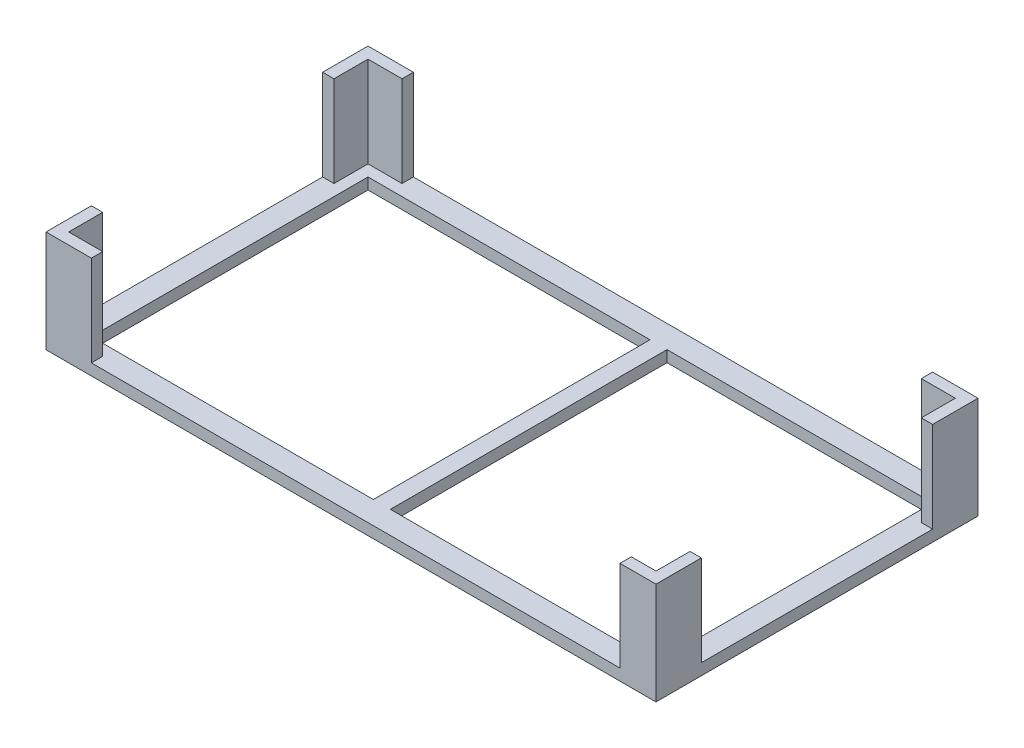
ISO-10303-21;
HEADER;
FILE_DESCRIPTION(('STEP AP214'),'2;1');
FILE_NAME('part.step','',(''),(''),'','','');
FILE_SCHEMA(('AUTOMOTIVE_DESIGN { 1 0 10303 214 1 1 1 1 }'));
ENDSEC;
DATA;
#1=APPLICATION_CONTEXT('core data for automotive mechanical design processes');
#2=APPLICATION_PROTOCOL_DEFINITION('international standard','automotive_design',2000,#1);
#3=PRODUCT_CONTEXT('',#1,'mechanical');
#4=PRODUCT('Part','Part','',(#3));
#5=PRODUCT_RELATED_PRODUCT_CATEGORY('part','',(#4));
#6=PRODUCT_DEFINITION_FORMATION('','',#4);
#7=PRODUCT_DEFINITION_CONTEXT('part definition',#1,'design');
#8=PRODUCT_DEFINITION('design','',#6,#7);
#9=PRODUCT_DEFINITION_SHAPE('','',#8);
#10=(LENGTH_UNIT() NAMED_UNIT(*) SI_UNIT(.MILLI.,.METRE.));
#11=(NAMED_UNIT(*) PLANE_ANGLE_UNIT() SI_UNIT($,.RADIAN.));
#12=(NAMED_UNIT(*) SI_UNIT($,.STERADIAN.) SOLID_ANGLE_UNIT());
#13=UNCERTAINTY_MEASURE_WITH_UNIT(LENGTH_MEASURE(1.E-05),#10,'distance_accuracy_value','');
#14=(GEOMETRIC_REPRESENTATION_CONTEXT(3) GLOBAL_UNCERTAINTY_ASSIGNED_CONTEXT((#13)) GLOBAL_UNIT_ASSIGNED_CONTEXT((#10,
#11,#12)) REPRESENTATION_CONTEXT('',''));
#15=CARTESIAN_POINT('',(0.,0.,0.));
#16=DIRECTION('',(0.,0.,1.));
#17=DIRECTION('',(1.,0.,0.));
#18=AXIS2_PLACEMENT_3D('',#15,#16,#17);
#19=CARTESIAN_POINT('',(0.,1.,0.));
#20=DIRECTION('',(0.,1.,0.));
#21=DIRECTION('',(0.,0.,1.));
#22=AXIS2_PLACEMENT_3D('',#19,#20,#21);
#23=PLANE('',#22);
#24=DIRECTION('',(0.,0.,-1.));
#25=VECTOR('',#24,1.);
#26=CARTESIAN_POINT('',(26.8729730527753,1.,0.));
#27=LINE('',#26,#25);
#28=CARTESIAN_POINT('',(26.8729730527753,1.,26.4));
#29=VERTEX_POINT('',#28);
#30=CARTESIAN_POINT('',(26.8729730527753,1.,2.));
#31=VERTEX_POINT('',#30);
#32=EDGE_CURVE('E275',#29,#31,#27,.T.);
#33=ORIENTED_EDGE('',*,*,#32,.F.);
#34=DIRECTION('',(1.,0.,0.));
#35=VECTOR('',#34,1.);
#36=CARTESIAN_POINT('',(0.,1.,26.4));
#37=LINE('',#36,#35);
#38=CARTESIAN_POINT('',(2.00000000000001,1.,26.4));
#39=VERTEX_POINT('',#38);
#40=EDGE_CURVE('E268',#39,#29,#37,.T.);
#41=ORIENTED_EDGE('',*,*,#40,.F.);
#42=DIRECTION('',(0.,0.,1.));
#43=VECTOR('',#42,1.);
#44=CARTESIAN_POINT('',(2.,1.,0.));
#45=LINE('',#44,#43);
#46=CARTESIAN_POINT('',(2.,1.,2.));
#47=VERTEX_POINT('',#46);
#48=EDGE_CURVE('E248',#47,#39,#45,.T.);
#49=ORIENTED_EDGE('',*,*,#48,.F.);
#50=DIRECTION('',(-1.,0.,0.));
#51=VECTOR('',#50,1.);
#52=CARTESIAN_POINT('',(0.,1.,2.));
#53=LINE('',#52,#51);
#54=EDGE_CURVE('E273',#31,#47,#53,.T.);
#55=ORIENTED_EDGE('',*,*,#54,.F.);
#56=EDGE_LOOP('',(#33,#41,#49,#55));
#57=FACE_BOUND('',#56,.T.);
#58=DIRECTION('',(0.,0.,1.));
#59=VECTOR('',#58,1.);
#60=CARTESIAN_POINT('',(28.3729730527753,1.,0.));
#61=LINE('',#60,#59);
#62=CARTESIAN_POINT('',(28.3729730527753,1.,2.));
#63=VERTEX_POINT('',#62);
#64=CARTESIAN_POINT('',(28.3729730527753,1.,26.4));
#65=VERTEX_POINT('',#64);
#66=EDGE_CURVE('E304',#63,#65,#61,.T.);
#67=ORIENTED_EDGE('',*,*,#66,.F.);
#68=DIRECTION('',(-1.,0.,0.));
#69=VECTOR('',#68,1.);
#70=CARTESIAN_POINT('',(0.,1.,2.));
#71=LINE('',#70,#69);
#72=CARTESIAN_POINT('',(51.8,1.,2.));
#73=VERTEX_POINT('',#72);
#74=EDGE_CURVE('E291',#73,#63,#71,.T.);
#75=ORIENTED_EDGE('',*,*,#74,.F.);
#76=DIRECTION('',(0.,0.,-1.));
#77=VECTOR('',#76,1.);
#78=CARTESIAN_POINT('',(51.8,1.,0.));
#79=LINE('',#78,#77);
#80=CARTESIAN_POINT('',(51.8,1.,26.4));
#81=VERTEX_POINT('',#80);
#82=EDGE_CURVE('E299',#81,#73,#79,.T.);
#83=ORIENTED_EDGE('',*,*,#82,.F.);
#84=DIRECTION('',(1.,0.,0.));
#85=VECTOR('',#84,1.);
#86=CARTESIAN_POINT('',(0.,1.,26.4));
#87=LINE('',#86,#85);
#88=EDGE_CURVE('E302',#65,#81,#87,.T.);
#89=ORIENTED_EDGE('',*,*,#88,.F.);
#90=EDGE_LOOP('',(#67,#75,#83,#89));
#91=FACE_BOUND('',#90,.T.);
#92=DIRECTION('',(0.,0.,-1.));
#93=VECTOR('',#92,1.);
#94=CARTESIAN_POINT('',(1.,1.,1.));
#95=LINE('',#94,#93);
#96=CARTESIAN_POINT('',(1.,1.,4.));
#97=VERTEX_POINT('',#96);
#98=CARTESIAN_POINT('',(1.,1.,1.));
#99=VERTEX_POINT('',#98);
#100=EDGE_CURVE('E324',#97,#99,#95,.T.);
#101=ORIENTED_EDGE('',*,*,#100,.F.);
#102=DIRECTION('',(1.,0.,0.));
#103=VECTOR('',#102,1.);
#104=CARTESIAN_POINT('',(0.,1.,4.));
#105=LINE('',#104,#103);
#106=CARTESIAN_POINT('',(0.,1.,4.));
#107=VERTEX_POINT('',#106);
#108=EDGE_CURVE('E306',#107,#97,#105,.T.);
#109=ORIENTED_EDGE('',*,*,#108,.F.);
#110=DIRECTION('',(0.,0.,1.));
#111=VECTOR('',#110,1.);
#112=CARTESIAN_POINT('',(0.,1.,0.));
#113=LINE('',#112,#111);
#114=CARTESIAN_POINT('',(0.,1.,24.4));
#115=VERTEX_POINT('',#114);
#116=EDGE_CURVE('E464',#107,#115,#113,.T.);
#117=ORIENTED_EDGE('',*,*,#116,.T.);
#118=DIRECTION('',(-1.,0.,0.));
#119=VECTOR('',#118,1.);
#120=CARTESIAN_POINT('',(0.,1.,24.4));
#121=LINE('',#120,#119);
#122=CARTESIAN_POINT('',(1.,1.,24.4));
#123=VERTEX_POINT('',#122);
#124=EDGE_CURVE('E365',#123,#115,#121,.T.);
#125=ORIENTED_EDGE('',*,*,#124,.F.);
#126=DIRECTION('',(0.,0.,-1.));
#127=VECTOR('',#126,1.);
#128=CARTESIAN_POINT('',(1.,1.,27.4));
#129=LINE('',#128,#127);
#130=CARTESIAN_POINT('',(1.,1.,27.4));
#131=VERTEX_POINT('',#130);
#132=EDGE_CURVE('E346',#131,#123,#129,.T.);
#133=ORIENTED_EDGE('',*,*,#132,.F.);
#134=DIRECTION('',(-1.,0.,0.));
#135=VECTOR('',#134,1.);
#136=CARTESIAN_POINT('',(1.,1.,27.4));
#137=LINE('',#136,#135);
#138=CARTESIAN_POINT('',(4.00000000000001,1.,27.4));
#139=VERTEX_POINT('',#138);
#140=EDGE_CURVE('E351',#139,#131,#137,.T.);
#141=ORIENTED_EDGE('',*,*,#140,.F.);
#142=DIRECTION('',(0.,0.,-1.));
#143=VECTOR('',#142,1.);
#144=CARTESIAN_POINT('',(4.00000000000001,1.,28.4));
#145=LINE('',#144,#143);
#146=CARTESIAN_POINT('',(4.00000000000001,1.,28.4));
#147=VERTEX_POINT('',#146);
#148=EDGE_CURVE('E368',#147,#139,#145,.T.);
#149=ORIENTED_EDGE('',*,*,#148,.F.);
#150=DIRECTION('',(1.,0.,0.));
#151=VECTOR('',#150,1.);
#152=CARTESIAN_POINT('',(0.,1.,28.4));
#153=LINE('',#152,#151);
#154=CARTESIAN_POINT('',(50.6219949365268,1.,28.4));
#155=VERTEX_POINT('',#154);
#156=EDGE_CURVE('E466',#147,#155,#153,.T.);
#157=ORIENTED_EDGE('',*,*,#156,.T.);
#158=DIRECTION('',(0.,0.,1.));
#159=VECTOR('',#158,1.);
#160=CARTESIAN_POINT('',(50.6219949365268,1.,28.4));
#161=LINE('',#160,#159);
#162=CARTESIAN_POINT('',(50.6219949365268,1.,27.4));
#163=VERTEX_POINT('',#162);
#164=EDGE_CURVE('E427',#163,#155,#161,.T.);
#165=ORIENTED_EDGE('',*,*,#164,.F.);
#166=DIRECTION('',(-1.,0.,0.));
#167=VECTOR('',#166,1.);
#168=CARTESIAN_POINT('',(52.8,1.,27.4));
#169=LINE('',#168,#167);
#170=CARTESIAN_POINT('',(52.8,1.,27.4));
#171=VERTEX_POINT('',#170);
#172=EDGE_CURVE('E444',#171,#163,#169,.T.);
#173=ORIENTED_EDGE('',*,*,#172,.F.);
#174=DIRECTION('',(0.,0.,1.));
#175=VECTOR('',#174,1.);
#176=CARTESIAN_POINT('',(52.8,1.,27.4));
#177=LINE('',#176,#175);
#178=CARTESIAN_POINT('',(52.8,1.,24.4));
#179=VERTEX_POINT('',#178);
#180=EDGE_CURVE('E441',#179,#171,#177,.T.);
#181=ORIENTED_EDGE('',*,*,#180,.F.);
#182=DIRECTION('',(-1.,0.,0.));
#183=VECTOR('',#182,1.);
#184=CARTESIAN_POINT('',(53.8,1.,24.4));
#185=LINE('',#184,#183);
#186=CARTESIAN_POINT('',(53.8,1.,24.4));
#187=VERTEX_POINT('',#186);
#188=EDGE_CURVE('E422',#187,#179,#185,.T.);
#189=ORIENTED_EDGE('',*,*,#188,.F.);
#190=DIRECTION('',(0.,0.,-1.));
#191=VECTOR('',#190,1.);
#192=CARTESIAN_POINT('',(53.8,1.,0.));
#193=LINE('',#192,#191);
#194=CARTESIAN_POINT('',(53.8,1.,4.));
#195=VERTEX_POINT('',#194);
#196=EDGE_CURVE('E469',#187,#195,#193,.T.);
#197=ORIENTED_EDGE('',*,*,#196,.T.);
#198=DIRECTION('',(1.,0.,0.));
#199=VECTOR('',#198,1.);
#200=CARTESIAN_POINT('',(53.8,1.,4.));
#201=LINE('',#200,#199);
#202=CARTESIAN_POINT('',(52.8,1.,4.));
#203=VERTEX_POINT('',#202);
#204=EDGE_CURVE('E392',#203,#195,#201,.T.);
#205=ORIENTED_EDGE('',*,*,#204,.F.);
#206=DIRECTION('',(0.,0.,1.));
#207=VECTOR('',#206,1.);
#208=CARTESIAN_POINT('',(52.8,1.,1.));
#209=LINE('',#208,#207);
#210=CARTESIAN_POINT('',(52.8,1.,1.));
#211=VERTEX_POINT('',#210);
#212=EDGE_CURVE('E406',#211,#203,#209,.T.);
#213=ORIENTED_EDGE('',*,*,#212,.F.);
#214=DIRECTION('',(1.,0.,0.));
#215=VECTOR('',#214,1.);
#216=CARTESIAN_POINT('',(52.8,1.,1.));
#217=LINE('',#216,#215);
#218=CARTESIAN_POINT('',(49.8,1.,1.));
#219=VERTEX_POINT('',#218);
#220=EDGE_CURVE('E404',#219,#211,#217,.T.);
#221=ORIENTED_EDGE('',*,*,#220,.F.);
#222=DIRECTION('',(0.,0.,1.));
#223=VECTOR('',#222,1.);
#224=CARTESIAN_POINT('',(49.8,1.,0.));
#225=LINE('',#224,#223);
#226=CARTESIAN_POINT('',(49.8,1.,0.));
#227=VERTEX_POINT('',#226);
#228=EDGE_CURVE('E387',#227,#219,#225,.T.);
#229=ORIENTED_EDGE('',*,*,#228,.F.);
#230=DIRECTION('',(-1.,0.,0.));
#231=VECTOR('',#230,1.);
#232=CARTESIAN_POINT('',(0.,1.,0.));
#233=LINE('',#232,#231);
#234=CARTESIAN_POINT('',(4.,1.,0.));
#235=VERTEX_POINT('',#234);
#236=EDGE_CURVE('E472',#227,#235,#233,.T.);
#237=ORIENTED_EDGE('',*,*,#236,.T.);
#238=DIRECTION('',(0.,0.,-1.));
#239=VECTOR('',#238,1.);
#240=CARTESIAN_POINT('',(4.,1.,0.));
#241=LINE('',#240,#239);
#242=CARTESIAN_POINT('',(4.,1.,1.));
#243=VERTEX_POINT('',#242);
#244=EDGE_CURVE('E310',#243,#235,#241,.T.);
#245=ORIENTED_EDGE('',*,*,#244,.F.);
#246=DIRECTION('',(1.,0.,0.));
#247=VECTOR('',#246,1.);
#248=CARTESIAN_POINT('',(1.,1.,1.));
#249=LINE('',#248,#247);
#250=EDGE_CURVE('E327',#99,#243,#249,.T.);
#251=ORIENTED_EDGE('',*,*,#250,.F.);
#252=EDGE_LOOP('',(#101,#109,#117,#125,#133,#141,#149,#157,#165,#173,#181,#189,#197,#205,#213,
#221,#229,#237,#245,#251));
#253=FACE_BOUND('',#252,.T.);
#254=ADVANCED_FACE('F33',(#57,#91,#253),#23,.T.);
#255=CARTESIAN_POINT('',(0.,1.,0.));
#256=DIRECTION('',(1.,0.,0.));
#257=DIRECTION('',(0.,0.,-1.));
#258=AXIS2_PLACEMENT_3D('',#255,#256,#257);
#259=PLANE('',#258);
#260=DIRECTION('',(0.,0.,1.));
#261=VECTOR('',#260,1.);
#262=CARTESIAN_POINT('',(0.,0.,0.));
#263=LINE('',#262,#261);
#264=CARTESIAN_POINT('',(0.,0.,0.));
#265=VERTEX_POINT('',#264);
#266=CARTESIAN_POINT('',(0.,0.,28.4));
#267=VERTEX_POINT('',#266);
#268=EDGE_CURVE('E463',#265,#267,#263,.T.);
#269=ORIENTED_EDGE('',*,*,#268,.T.);
#270=DIRECTION('',(0.,-1.,0.));
#271=VECTOR('',#270,1.);
#272=CARTESIAN_POINT('',(0.,1.,28.4));
#273=LINE('',#272,#271);
#274=CARTESIAN_POINT('',(0.,9.,28.4));
#275=VERTEX_POINT('',#274);
#276=EDGE_CURVE('E11',#275,#267,#273,.T.);
#277=ORIENTED_EDGE('',*,*,#276,.F.);
#278=DIRECTION('',(0.,0.,1.));
#279=VECTOR('',#278,1.);
#280=CARTESIAN_POINT('',(0.,9.,27.4));
#281=LINE('',#280,#279);
#282=CARTESIAN_POINT('',(0.,9.,24.4));
#283=VERTEX_POINT('',#282);
#284=EDGE_CURVE('E353',#283,#275,#281,.T.);
#285=ORIENTED_EDGE('',*,*,#284,.F.);
#286=DIRECTION('',(0.,-1.,0.));
#287=VECTOR('',#286,1.);
#288=CARTESIAN_POINT('',(0.,9.,24.4));
#289=LINE('',#288,#287);
#290=EDGE_CURVE('E381',#283,#115,#289,.T.);
#291=ORIENTED_EDGE('',*,*,#290,.T.);
#292=ORIENTED_EDGE('',*,*,#116,.F.);
#293=DIRECTION('',(0.,-1.,0.));
#294=VECTOR('',#293,1.);
#295=CARTESIAN_POINT('',(0.,9.,4.));
#296=LINE('',#295,#294);
#297=CARTESIAN_POINT('',(0.,9.,4.));
#298=VERTEX_POINT('',#297);
#299=EDGE_CURVE('E343',#298,#107,#296,.T.);
#300=ORIENTED_EDGE('',*,*,#299,.F.);
#301=DIRECTION('',(0.,0.,1.));
#302=VECTOR('',#301,1.);
#303=CARTESIAN_POINT('',(0.,9.,0.));
#304=LINE('',#303,#302);
#305=CARTESIAN_POINT('',(0.,9.,0.));
#306=VERTEX_POINT('',#305);
#307=EDGE_CURVE('E307',#306,#298,#304,.T.);
#308=ORIENTED_EDGE('',*,*,#307,.F.);
#309=DIRECTION('',(0.,-1.,0.));
#310=VECTOR('',#309,1.);
#311=CARTESIAN_POINT('',(0.,1.,0.));
#312=LINE('',#311,#310);
#313=EDGE_CURVE('E474',#306,#265,#312,.T.);
#314=ORIENTED_EDGE('',*,*,#313,.T.);
#315=EDGE_LOOP('',(#269,#277,#285,#291,#292,#300,#308,#314));
#316=FACE_BOUND('',#315,.T.);
#317=ADVANCED_FACE('F35',(#316),#259,.F.);
#318=CARTESIAN_POINT('',(0.,1.,28.4));
#319=DIRECTION('',(0.,0.,-1.));
#320=DIRECTION('',(-1.,0.,0.));
#321=AXIS2_PLACEMENT_3D('',#318,#319,#320);
#322=PLANE('',#321);
#323=DIRECTION('',(1.,0.,0.));
#324=VECTOR('',#323,1.);
#325=CARTESIAN_POINT('',(0.,0.,28.4));
#326=LINE('',#325,#324);
#327=CARTESIAN_POINT('',(53.8,0.,28.4));
#328=VERTEX_POINT('',#327);
#329=EDGE_CURVE('E477',#267,#328,#326,.T.);
#330=ORIENTED_EDGE('',*,*,#329,.T.);
#331=DIRECTION('',(0.,-1.,0.));
#332=VECTOR('',#331,1.);
#333=CARTESIAN_POINT('',(53.8,1.,28.4));
#334=LINE('',#333,#332);
#335=CARTESIAN_POINT('',(53.8,9.,28.4));
#336=VERTEX_POINT('',#335);
#337=EDGE_CURVE('E41',#336,#328,#334,.T.);
#338=ORIENTED_EDGE('',*,*,#337,.F.);
#339=DIRECTION('',(1.,0.,0.));
#340=VECTOR('',#339,1.);
#341=CARTESIAN_POINT('',(53.6219949365268,9.,28.4));
#342=LINE('',#341,#340);
#343=CARTESIAN_POINT('',(50.6219949365268,9.,28.4));
#344=VERTEX_POINT('',#343);
#345=EDGE_CURVE('E435',#344,#336,#342,.T.);
#346=ORIENTED_EDGE('',*,*,#345,.F.);
#347=DIRECTION('',(0.,-1.,0.));
#348=VECTOR('',#347,1.);
#349=CARTESIAN_POINT('',(50.6219949365268,9.,28.4));
#350=LINE('',#349,#348);
#351=EDGE_CURVE('E438',#344,#155,#350,.T.);
#352=ORIENTED_EDGE('',*,*,#351,.T.);
#353=ORIENTED_EDGE('',*,*,#156,.F.);
#354=DIRECTION('',(0.,-1.,0.));
#355=VECTOR('',#354,1.);
#356=CARTESIAN_POINT('',(4.00000000000001,9.,28.4));
#357=LINE('',#356,#355);
#358=CARTESIAN_POINT('',(4.00000000000001,9.,28.4));
#359=VERTEX_POINT('',#358);
#360=EDGE_CURVE('E378',#359,#147,#357,.T.);
#361=ORIENTED_EDGE('',*,*,#360,.F.);
#362=DIRECTION('',(1.,0.,0.));
#363=VECTOR('',#362,1.);
#364=CARTESIAN_POINT('',(0.,9.,28.4));
#365=LINE('',#364,#363);
#366=EDGE_CURVE('E356',#275,#359,#365,.T.);
#367=ORIENTED_EDGE('',*,*,#366,.F.);
#368=ORIENTED_EDGE('',*,*,#276,.T.);
#369=EDGE_LOOP('',(#330,#338,#346,#352,#353,#361,#367,#368));
#370=FACE_BOUND('',#369,.T.);
#371=ADVANCED_FACE('F544',(#370),#322,.F.);
#372=CARTESIAN_POINT('',(53.8,1.,0.));
#373=DIRECTION('',(-1.,0.,0.));
#374=DIRECTION('',(0.,0.,1.));
#375=AXIS2_PLACEMENT_3D('',#372,#373,#374);
#376=PLANE('',#375);
#377=DIRECTION('',(0.,0.,-1.));
#378=VECTOR('',#377,1.);
#379=CARTESIAN_POINT('',(53.8,0.,0.));
#380=LINE('',#379,#378);
#381=CARTESIAN_POINT('',(53.8,0.,0.));
#382=VERTEX_POINT('',#381);
#383=EDGE_CURVE('E479',#328,#382,#380,.T.);
#384=ORIENTED_EDGE('',*,*,#383,.T.);
#385=DIRECTION('',(0.,-1.,0.));
#386=VECTOR('',#385,1.);
#387=CARTESIAN_POINT('',(53.8,1.,0.));
#388=LINE('',#387,#386);
#389=CARTESIAN_POINT('',(53.8,9.,0.));
#390=VERTEX_POINT('',#389);
#391=EDGE_CURVE('E484',#390,#382,#388,.T.);
#392=ORIENTED_EDGE('',*,*,#391,.F.);
#393=DIRECTION('',(0.,0.,-1.));
#394=VECTOR('',#393,1.);
#395=CARTESIAN_POINT('',(53.8,9.,0.));
#396=LINE('',#395,#394);
#397=CARTESIAN_POINT('',(53.8,9.,4.));
#398=VERTEX_POINT('',#397);
#399=EDGE_CURVE('E388',#398,#390,#396,.T.);
#400=ORIENTED_EDGE('',*,*,#399,.F.);
#401=DIRECTION('',(0.,-1.,0.));
#402=VECTOR('',#401,1.);
#403=CARTESIAN_POINT('',(53.8,9.,4.));
#404=LINE('',#403,#402);
#405=EDGE_CURVE('E402',#398,#195,#404,.T.);
#406=ORIENTED_EDGE('',*,*,#405,.T.);
#407=ORIENTED_EDGE('',*,*,#196,.F.);
#408=DIRECTION('',(0.,-1.,0.));
#409=VECTOR('',#408,1.);
#410=CARTESIAN_POINT('',(53.8,9.,24.4));
#411=LINE('',#410,#409);
#412=CARTESIAN_POINT('',(53.8,9.,24.4));
#413=VERTEX_POINT('',#412);
#414=EDGE_CURVE('E460',#413,#187,#411,.T.);
#415=ORIENTED_EDGE('',*,*,#414,.F.);
#416=DIRECTION('',(0.,0.,-1.));
#417=VECTOR('',#416,1.);
#418=CARTESIAN_POINT('',(53.8,9.,28.4));
#419=LINE('',#418,#417);
#420=EDGE_CURVE('E423',#336,#413,#419,.T.);
#421=ORIENTED_EDGE('',*,*,#420,.F.);
#422=ORIENTED_EDGE('',*,*,#337,.T.);
#423=EDGE_LOOP('',(#384,#392,#400,#406,#407,#415,#421,#422));
#424=FACE_BOUND('',#423,.T.);
#425=ADVANCED_FACE('F490',(#424),#376,.F.);
#426=CARTESIAN_POINT('',(0.,1.,0.));
#427=DIRECTION('',(0.,0.,1.));
#428=DIRECTION('',(1.,0.,0.));
#429=AXIS2_PLACEMENT_3D('',#426,#427,#428);
#430=PLANE('',#429);
#431=DIRECTION('',(-1.,0.,0.));
#432=VECTOR('',#431,1.);
#433=CARTESIAN_POINT('',(0.,0.,0.));
#434=LINE('',#433,#432);
#435=EDGE_CURVE('E467',#382,#265,#434,.T.);
#436=ORIENTED_EDGE('',*,*,#435,.T.);
#437=ORIENTED_EDGE('',*,*,#313,.F.);
#438=DIRECTION('',(-1.,0.,0.));
#439=VECTOR('',#438,1.);
#440=CARTESIAN_POINT('',(0.,9.,0.));
#441=LINE('',#440,#439);
#442=CARTESIAN_POINT('',(4.,9.,0.));
#443=VERTEX_POINT('',#442);
#444=EDGE_CURVE('E318',#443,#306,#441,.T.);
#445=ORIENTED_EDGE('',*,*,#444,.F.);
#446=DIRECTION('',(0.,-1.,0.));
#447=VECTOR('',#446,1.);
#448=CARTESIAN_POINT('',(4.,9.,0.));
#449=LINE('',#448,#447);
#450=EDGE_CURVE('E321',#443,#235,#449,.T.);
#451=ORIENTED_EDGE('',*,*,#450,.T.);
#452=ORIENTED_EDGE('',*,*,#236,.F.);
#453=DIRECTION('',(0.,-1.,0.));
#454=VECTOR('',#453,1.);
#455=CARTESIAN_POINT('',(49.8,9.,0.));
#456=LINE('',#455,#454);
#457=CARTESIAN_POINT('',(49.8,9.,0.));
#458=VERTEX_POINT('',#457);
#459=EDGE_CURVE('E420',#458,#227,#456,.T.);
#460=ORIENTED_EDGE('',*,*,#459,.F.);
#461=DIRECTION('',(-1.,0.,0.));
#462=VECTOR('',#461,1.);
#463=CARTESIAN_POINT('',(53.8,9.,0.));
#464=LINE('',#463,#462);
#465=EDGE_CURVE('E391',#390,#458,#464,.T.);
#466=ORIENTED_EDGE('',*,*,#465,.F.);
#467=ORIENTED_EDGE('',*,*,#391,.T.);
#468=EDGE_LOOP('',(#436,#437,#445,#451,#452,#460,#466,#467));
#469=FACE_BOUND('',#468,.T.);
#470=ADVANCED_FACE('F498',(#469),#430,.F.);
#471=CARTESIAN_POINT('',(0.,0.,0.));
#472=DIRECTION('',(0.,1.,0.));
#473=DIRECTION('',(0.,0.,1.));
#474=AXIS2_PLACEMENT_3D('',#471,#472,#473);
#475=PLANE('',#474);
#476=DIRECTION('',(-1.,0.,0.));
#477=VECTOR('',#476,1.);
#478=CARTESIAN_POINT('',(26.8729730527753,0.,26.4));
#479=LINE('',#478,#477);
#480=CARTESIAN_POINT('',(26.8729730527753,0.,26.4));
#481=VERTEX_POINT('',#480);
#482=CARTESIAN_POINT('',(2.00000000000001,0.,26.4));
#483=VERTEX_POINT('',#482);
#484=EDGE_CURVE('E254',#481,#483,#479,.T.);
#485=ORIENTED_EDGE('',*,*,#484,.F.);
#486=DIRECTION('',(0.,0.,1.));
#487=VECTOR('',#486,1.);
#488=CARTESIAN_POINT('',(26.8729730527753,0.,2.));
#489=LINE('',#488,#487);
#490=CARTESIAN_POINT('',(26.8729730527753,0.,2.));
#491=VERTEX_POINT('',#490);
#492=EDGE_CURVE('E56',#491,#481,#489,.T.);
#493=ORIENTED_EDGE('',*,*,#492,.F.);
#494=DIRECTION('',(1.,0.,0.));
#495=VECTOR('',#494,1.);
#496=CARTESIAN_POINT('',(2.,0.,2.));
#497=LINE('',#496,#495);
#498=CARTESIAN_POINT('',(2.,0.,2.));
#499=VERTEX_POINT('',#498);
#500=EDGE_CURVE('E261',#499,#491,#497,.T.);
#501=ORIENTED_EDGE('',*,*,#500,.F.);
#502=DIRECTION('',(0.,0.,-1.));
#503=VECTOR('',#502,1.);
#504=CARTESIAN_POINT('',(2.00000000000001,0.,26.4));
#505=LINE('',#504,#503);
#506=EDGE_CURVE('E245',#483,#499,#505,.T.);
#507=ORIENTED_EDGE('',*,*,#506,.F.);
#508=EDGE_LOOP('',(#485,#493,#501,#507));
#509=FACE_BOUND('',#508,.T.);
#510=DIRECTION('',(1.,0.,0.));
#511=VECTOR('',#510,1.);
#512=CARTESIAN_POINT('',(28.3729730527753,0.,2.));
#513=LINE('',#512,#511);
#514=CARTESIAN_POINT('',(28.3729730527753,0.,2.));
#515=VERTEX_POINT('',#514);
#516=CARTESIAN_POINT('',(51.8,0.,2.));
#517=VERTEX_POINT('',#516);
#518=EDGE_CURVE('E279',#515,#517,#513,.T.);
#519=ORIENTED_EDGE('',*,*,#518,.F.);
#520=DIRECTION('',(0.,0.,-1.));
#521=VECTOR('',#520,1.);
#522=CARTESIAN_POINT('',(28.3729730527753,0.,2.));
#523=LINE('',#522,#521);
#524=CARTESIAN_POINT('',(28.3729730527753,0.,26.4));
#525=VERTEX_POINT('',#524);
#526=EDGE_CURVE('E277',#525,#515,#523,.T.);
#527=ORIENTED_EDGE('',*,*,#526,.F.);
#528=DIRECTION('',(-1.,0.,0.));
#529=VECTOR('',#528,1.);
#530=CARTESIAN_POINT('',(51.8,0.,26.4));
#531=LINE('',#530,#529);
#532=CARTESIAN_POINT('',(51.8,0.,26.4));
#533=VERTEX_POINT('',#532);
#534=EDGE_CURVE('E285',#533,#525,#531,.T.);
#535=ORIENTED_EDGE('',*,*,#534,.F.);
#536=DIRECTION('',(0.,0.,1.));
#537=VECTOR('',#536,1.);
#538=CARTESIAN_POINT('',(51.8,0.,2.));
#539=LINE('',#538,#537);
#540=EDGE_CURVE('E282',#517,#533,#539,.T.);
#541=ORIENTED_EDGE('',*,*,#540,.F.);
#542=EDGE_LOOP('',(#519,#527,#535,#541));
#543=FACE_BOUND('',#542,.T.);
#544=ORIENTED_EDGE('',*,*,#268,.F.);
#545=ORIENTED_EDGE('',*,*,#435,.F.);
#546=ORIENTED_EDGE('',*,*,#383,.F.);
#547=ORIENTED_EDGE('',*,*,#329,.F.);
#548=EDGE_LOOP('',(#544,#545,#546,#547));
#549=FACE_BOUND('',#548,.T.);
#550=ADVANCED_FACE('F258',(#509,#543,#549),#475,.F.);
#551=CARTESIAN_POINT('',(53.8,9.,24.4));
#552=DIRECTION('',(0.,0.,1.));
#553=DIRECTION('',(1.,0.,0.));
#554=AXIS2_PLACEMENT_3D('',#551,#552,#553);
#555=PLANE('',#554);
#556=ORIENTED_EDGE('',*,*,#188,.T.);
#557=DIRECTION('',(0.,-1.,0.));
#558=VECTOR('',#557,1.);
#559=CARTESIAN_POINT('',(52.8,9.,24.4));
#560=LINE('',#559,#558);
#561=CARTESIAN_POINT('',(52.8,9.,24.4));
#562=VERTEX_POINT('',#561);
#563=EDGE_CURVE('E457',#562,#179,#560,.T.);
#564=ORIENTED_EDGE('',*,*,#563,.F.);
#565=DIRECTION('',(-1.,0.,0.));
#566=VECTOR('',#565,1.);
#567=CARTESIAN_POINT('',(53.8,9.,24.4));
#568=LINE('',#567,#566);
#569=EDGE_CURVE('E426',#413,#562,#568,.T.);
#570=ORIENTED_EDGE('',*,*,#569,.F.);
#571=ORIENTED_EDGE('',*,*,#414,.T.);
#572=EDGE_LOOP('',(#556,#564,#570,#571));
#573=FACE_BOUND('',#572,.T.);
#574=ADVANCED_FACE('F549',(#573),#555,.F.);
#575=CARTESIAN_POINT('',(52.8,9.,27.4));
#576=DIRECTION('',(1.,0.,0.));
#577=DIRECTION('',(0.,0.,-1.));
#578=AXIS2_PLACEMENT_3D('',#575,#576,#577);
#579=PLANE('',#578);
#580=ORIENTED_EDGE('',*,*,#180,.T.);
#581=DIRECTION('',(0.,-1.,0.));
#582=VECTOR('',#581,1.);
#583=CARTESIAN_POINT('',(52.8,9.,27.4));
#584=LINE('',#583,#582);
#585=CARTESIAN_POINT('',(52.8,9.,27.4));
#586=VERTEX_POINT('',#585);
#587=EDGE_CURVE('E454',#586,#171,#584,.T.);
#588=ORIENTED_EDGE('',*,*,#587,.F.);
#589=DIRECTION('',(0.,0.,1.));
#590=VECTOR('',#589,1.);
#591=CARTESIAN_POINT('',(52.8,9.,27.4));
#592=LINE('',#591,#590);
#593=EDGE_CURVE('E429',#562,#586,#592,.T.);
#594=ORIENTED_EDGE('',*,*,#593,.F.);
#595=ORIENTED_EDGE('',*,*,#563,.T.);
#596=EDGE_LOOP('',(#580,#588,#594,#595));
#597=FACE_BOUND('',#596,.T.);
#598=ADVANCED_FACE('F587',(#597),#579,.F.);
#599=CARTESIAN_POINT('',(52.8,9.,27.4));
#600=DIRECTION('',(0.,0.,1.));
#601=DIRECTION('',(1.,0.,0.));
#602=AXIS2_PLACEMENT_3D('',#599,#600,#601);
#603=PLANE('',#602);
#604=ORIENTED_EDGE('',*,*,#172,.T.);
#605=DIRECTION('',(0.,-1.,0.));
#606=VECTOR('',#605,1.);
#607=CARTESIAN_POINT('',(50.6219949365268,9.,27.4));
#608=LINE('',#607,#606);
#609=CARTESIAN_POINT('',(50.6219949365268,9.,27.4));
#610=VERTEX_POINT('',#609);
#611=EDGE_CURVE('E451',#610,#163,#608,.T.);
#612=ORIENTED_EDGE('',*,*,#611,.F.);
#613=DIRECTION('',(-1.,0.,0.));
#614=VECTOR('',#613,1.);
#615=CARTESIAN_POINT('',(52.8,9.,27.4));
#616=LINE('',#615,#614);
#617=EDGE_CURVE('E431',#586,#610,#616,.T.);
#618=ORIENTED_EDGE('',*,*,#617,.F.);
#619=ORIENTED_EDGE('',*,*,#587,.T.);
#620=EDGE_LOOP('',(#604,#612,#618,#619));
#621=FACE_BOUND('',#620,.T.);
#622=ADVANCED_FACE('F584',(#621),#603,.F.);
#623=CARTESIAN_POINT('',(50.6219949365268,9.,28.4));
#624=DIRECTION('',(1.,0.,0.));
#625=DIRECTION('',(0.,0.,-1.));
#626=AXIS2_PLACEMENT_3D('',#623,#624,#625);
#627=PLANE('',#626);
#628=ORIENTED_EDGE('',*,*,#164,.T.);
#629=ORIENTED_EDGE('',*,*,#351,.F.);
#630=DIRECTION('',(0.,0.,1.));
#631=VECTOR('',#630,1.);
#632=CARTESIAN_POINT('',(50.6219949365268,9.,28.4));
#633=LINE('',#632,#631);
#634=EDGE_CURVE('E433',#610,#344,#633,.T.);
#635=ORIENTED_EDGE('',*,*,#634,.F.);
#636=ORIENTED_EDGE('',*,*,#611,.T.);
#637=EDGE_LOOP('',(#628,#629,#635,#636));
#638=FACE_BOUND('',#637,.T.);
#639=ADVANCED_FACE('F579',(#638),#627,.F.);
#640=CARTESIAN_POINT('',(0.,9.,0.));
#641=DIRECTION('',(0.,1.,0.));
#642=DIRECTION('',(0.,0.,1.));
#643=AXIS2_PLACEMENT_3D('',#640,#641,#642);
#644=PLANE('',#643);
#645=ORIENTED_EDGE('',*,*,#420,.T.);
#646=ORIENTED_EDGE('',*,*,#569,.T.);
#647=ORIENTED_EDGE('',*,*,#593,.T.);
#648=ORIENTED_EDGE('',*,*,#617,.T.);
#649=ORIENTED_EDGE('',*,*,#634,.T.);
#650=ORIENTED_EDGE('',*,*,#345,.T.);
#651=EDGE_LOOP('',(#645,#646,#647,#648,#649,#650));
#652=FACE_BOUND('',#651,.T.);
#653=ADVANCED_FACE('F630',(#652),#644,.T.);
#654=CARTESIAN_POINT('',(49.8,9.,0.));
#655=DIRECTION('',(1.,0.,0.));
#656=DIRECTION('',(0.,0.,-1.));
#657=AXIS2_PLACEMENT_3D('',#654,#655,#656);
#658=PLANE('',#657);
#659=ORIENTED_EDGE('',*,*,#228,.T.);
#660=DIRECTION('',(0.,-1.,0.));
#661=VECTOR('',#660,1.);
#662=CARTESIAN_POINT('',(49.8,9.,1.));
#663=LINE('',#662,#661);
#664=CARTESIAN_POINT('',(49.8,9.,1.));
#665=VERTEX_POINT('',#664);
#666=EDGE_CURVE('E417',#665,#219,#663,.T.);
#667=ORIENTED_EDGE('',*,*,#666,.F.);
#668=DIRECTION('',(0.,0.,1.));
#669=VECTOR('',#668,1.);
#670=CARTESIAN_POINT('',(49.8,9.,0.));
#671=LINE('',#670,#669);
#672=EDGE_CURVE('E394',#458,#665,#671,.T.);
#673=ORIENTED_EDGE('',*,*,#672,.F.);
#674=ORIENTED_EDGE('',*,*,#459,.T.);
#675=EDGE_LOOP('',(#659,#667,#673,#674));
#676=FACE_BOUND('',#675,.T.);
#677=ADVANCED_FACE('F611',(#676),#658,.F.);
#678=CARTESIAN_POINT('',(52.8,9.,1.));
#679=DIRECTION('',(0.,0.,-1.));
#680=DIRECTION('',(-1.,0.,0.));
#681=AXIS2_PLACEMENT_3D('',#678,#679,#680);
#682=PLANE('',#681);
#683=ORIENTED_EDGE('',*,*,#220,.T.);
#684=DIRECTION('',(0.,-1.,0.));
#685=VECTOR('',#684,1.);
#686=CARTESIAN_POINT('',(52.8,9.,1.));
#687=LINE('',#686,#685);
#688=CARTESIAN_POINT('',(52.8,9.,1.));
#689=VERTEX_POINT('',#688);
#690=EDGE_CURVE('E414',#689,#211,#687,.T.);
#691=ORIENTED_EDGE('',*,*,#690,.F.);
#692=DIRECTION('',(1.,0.,0.));
#693=VECTOR('',#692,1.);
#694=CARTESIAN_POINT('',(52.8,9.,1.));
#695=LINE('',#694,#693);
#696=EDGE_CURVE('E396',#665,#689,#695,.T.);
#697=ORIENTED_EDGE('',*,*,#696,.F.);
#698=ORIENTED_EDGE('',*,*,#666,.T.);
#699=EDGE_LOOP('',(#683,#691,#697,#698));
#700=FACE_BOUND('',#699,.T.);
#701=ADVANCED_FACE('F607',(#700),#682,.F.);
#702=CARTESIAN_POINT('',(52.8,9.,1.));
#703=DIRECTION('',(1.,0.,0.));
#704=DIRECTION('',(0.,0.,-1.));
#705=AXIS2_PLACEMENT_3D('',#702,#703,#704);
#706=PLANE('',#705);
#707=ORIENTED_EDGE('',*,*,#212,.T.);
#708=DIRECTION('',(0.,-1.,0.));
#709=VECTOR('',#708,1.);
#710=CARTESIAN_POINT('',(52.8,9.,4.));
#711=LINE('',#710,#709);
#712=CARTESIAN_POINT('',(52.8,9.,4.));
#713=VERTEX_POINT('',#712);
#714=EDGE_CURVE('E412',#713,#203,#711,.T.);
#715=ORIENTED_EDGE('',*,*,#714,.F.);
#716=DIRECTION('',(0.,0.,1.));
#717=VECTOR('',#716,1.);
#718=CARTESIAN_POINT('',(52.8,9.,1.));
#719=LINE('',#718,#717);
#720=EDGE_CURVE('E398',#689,#713,#719,.T.);
#721=ORIENTED_EDGE('',*,*,#720,.F.);
#722=ORIENTED_EDGE('',*,*,#690,.T.);
#723=EDGE_LOOP('',(#707,#715,#721,#722));
#724=FACE_BOUND('',#723,.T.);
#725=ADVANCED_FACE('F602',(#724),#706,.F.);
#726=CARTESIAN_POINT('',(53.8,9.,4.));
#727=DIRECTION('',(0.,0.,-1.));
#728=DIRECTION('',(-1.,0.,0.));
#729=AXIS2_PLACEMENT_3D('',#726,#727,#728);
#730=PLANE('',#729);
#731=ORIENTED_EDGE('',*,*,#204,.T.);
#732=ORIENTED_EDGE('',*,*,#405,.F.);
#733=DIRECTION('',(1.,0.,0.));
#734=VECTOR('',#733,1.);
#735=CARTESIAN_POINT('',(53.8,9.,4.));
#736=LINE('',#735,#734);
#737=EDGE_CURVE('E400',#713,#398,#736,.T.);
#738=ORIENTED_EDGE('',*,*,#737,.F.);
#739=ORIENTED_EDGE('',*,*,#714,.T.);
#740=EDGE_LOOP('',(#731,#732,#738,#739));
#741=FACE_BOUND('',#740,.T.);
#742=ADVANCED_FACE('F597',(#741),#730,.F.);
#743=CARTESIAN_POINT('',(0.,9.,0.));
#744=DIRECTION('',(0.,-1.,0.));
#745=DIRECTION('',(0.,0.,-1.));
#746=AXIS2_PLACEMENT_3D('',#743,#744,#745);
#747=PLANE('',#746);
#748=ORIENTED_EDGE('',*,*,#399,.T.);
#749=ORIENTED_EDGE('',*,*,#465,.T.);
#750=ORIENTED_EDGE('',*,*,#672,.T.);
#751=ORIENTED_EDGE('',*,*,#696,.T.);
#752=ORIENTED_EDGE('',*,*,#720,.T.);
#753=ORIENTED_EDGE('',*,*,#737,.T.);
#754=EDGE_LOOP('',(#748,#749,#750,#751,#752,#753));
#755=FACE_BOUND('',#754,.T.);
#756=ADVANCED_FACE('F613',(#755),#747,.F.);
#757=CARTESIAN_POINT('',(1.,9.,27.4));
#758=DIRECTION('',(-1.,0.,0.));
#759=DIRECTION('',(0.,0.,1.));
#760=AXIS2_PLACEMENT_3D('',#757,#758,#759);
#761=PLANE('',#760);
#762=ORIENTED_EDGE('',*,*,#132,.T.);
#763=DIRECTION('',(0.,-1.,0.));
#764=VECTOR('',#763,1.);
#765=CARTESIAN_POINT('',(1.,9.,24.4));
#766=LINE('',#765,#764);
#767=CARTESIAN_POINT('',(1.,9.,24.4));
#768=VERTEX_POINT('',#767);
#769=EDGE_CURVE('E384',#768,#123,#766,.T.);
#770=ORIENTED_EDGE('',*,*,#769,.F.);
#771=DIRECTION('',(0.,0.,-1.));
#772=VECTOR('',#771,1.);
#773=CARTESIAN_POINT('',(1.,9.,27.4));
#774=LINE('',#773,#772);
#775=CARTESIAN_POINT('',(1.,9.,27.4));
#776=VERTEX_POINT('',#775);
#777=EDGE_CURVE('E347',#776,#768,#774,.T.);
#778=ORIENTED_EDGE('',*,*,#777,.F.);
#779=DIRECTION('',(0.,-1.,0.));
#780=VECTOR('',#779,1.);
#781=CARTESIAN_POINT('',(1.,9.,27.4));
#782=LINE('',#781,#780);
#783=EDGE_CURVE('E362',#776,#131,#782,.T.);
#784=ORIENTED_EDGE('',*,*,#783,.T.);
#785=EDGE_LOOP('',(#762,#770,#778,#784));
#786=FACE_BOUND('',#785,.T.);
#787=ADVANCED_FACE('F568',(#786),#761,.F.);
#788=CARTESIAN_POINT('',(0.,9.,24.4));
#789=DIRECTION('',(0.,0.,1.));
#790=DIRECTION('',(1.,0.,0.));
#791=AXIS2_PLACEMENT_3D('',#788,#789,#790);
#792=PLANE('',#791);
#793=ORIENTED_EDGE('',*,*,#124,.T.);
#794=ORIENTED_EDGE('',*,*,#290,.F.);
#795=DIRECTION('',(-1.,0.,0.));
#796=VECTOR('',#795,1.);
#797=CARTESIAN_POINT('',(0.,9.,24.4));
#798=LINE('',#797,#796);
#799=EDGE_CURVE('E350',#768,#283,#798,.T.);
#800=ORIENTED_EDGE('',*,*,#799,.F.);
#801=ORIENTED_EDGE('',*,*,#769,.T.);
#802=EDGE_LOOP('',(#793,#794,#800,#801));
#803=FACE_BOUND('',#802,.T.);
#804=ADVANCED_FACE('F566',(#803),#792,.F.);
#805=CARTESIAN_POINT('',(4.00000000000001,9.,28.4));
#806=DIRECTION('',(-1.,0.,0.));
#807=DIRECTION('',(0.,0.,1.));
#808=AXIS2_PLACEMENT_3D('',#805,#806,#807);
#809=PLANE('',#808);
#810=ORIENTED_EDGE('',*,*,#148,.T.);
#811=DIRECTION('',(0.,-1.,0.));
#812=VECTOR('',#811,1.);
#813=CARTESIAN_POINT('',(4.00000000000001,9.,27.4));
#814=LINE('',#813,#812);
#815=CARTESIAN_POINT('',(4.00000000000001,9.,27.4));
#816=VERTEX_POINT('',#815);
#817=EDGE_CURVE('E375',#816,#139,#814,.T.);
#818=ORIENTED_EDGE('',*,*,#817,.F.);
#819=DIRECTION('',(0.,0.,-1.));
#820=VECTOR('',#819,1.);
#821=CARTESIAN_POINT('',(4.00000000000001,9.,28.4));
#822=LINE('',#821,#820);
#823=EDGE_CURVE('E358',#359,#816,#822,.T.);
#824=ORIENTED_EDGE('',*,*,#823,.F.);
#825=ORIENTED_EDGE('',*,*,#360,.T.);
#826=EDGE_LOOP('',(#810,#818,#824,#825));
#827=FACE_BOUND('',#826,.T.);
#828=ADVANCED_FACE('F575',(#827),#809,.F.);
#829=CARTESIAN_POINT('',(1.,9.,27.4));
#830=DIRECTION('',(0.,0.,1.));
#831=DIRECTION('',(1.,0.,0.));
#832=AXIS2_PLACEMENT_3D('',#829,#830,#831);
#833=PLANE('',#832);
#834=ORIENTED_EDGE('',*,*,#140,.T.);
#835=ORIENTED_EDGE('',*,*,#783,.F.);
#836=DIRECTION('',(-1.,0.,0.));
#837=VECTOR('',#836,1.);
#838=CARTESIAN_POINT('',(1.,9.,27.4));
#839=LINE('',#838,#837);
#840=EDGE_CURVE('E360',#816,#776,#839,.T.);
#841=ORIENTED_EDGE('',*,*,#840,.F.);
#842=ORIENTED_EDGE('',*,*,#817,.T.);
#843=EDGE_LOOP('',(#834,#835,#841,#842));
#844=FACE_BOUND('',#843,.T.);
#845=ADVANCED_FACE('F535',(#844),#833,.F.);
#846=CARTESIAN_POINT('',(0.,9.,0.));
#847=DIRECTION('',(0.,-1.,0.));
#848=DIRECTION('',(0.,0.,-1.));
#849=AXIS2_PLACEMENT_3D('',#846,#847,#848);
#850=PLANE('',#849);
#851=ORIENTED_EDGE('',*,*,#777,.T.);
#852=ORIENTED_EDGE('',*,*,#799,.T.);
#853=ORIENTED_EDGE('',*,*,#284,.T.);
#854=ORIENTED_EDGE('',*,*,#366,.T.);
#855=ORIENTED_EDGE('',*,*,#823,.T.);
#856=ORIENTED_EDGE('',*,*,#840,.T.);
#857=EDGE_LOOP('',(#851,#852,#853,#854,#855,#856));
#858=FACE_BOUND('',#857,.T.);
#859=ADVANCED_FACE('F528',(#858),#850,.F.);
#860=CARTESIAN_POINT('',(0.,9.,4.));
#861=DIRECTION('',(0.,0.,-1.));
#862=DIRECTION('',(-1.,0.,0.));
#863=AXIS2_PLACEMENT_3D('',#860,#861,#862);
#864=PLANE('',#863);
#865=ORIENTED_EDGE('',*,*,#108,.T.);
#866=DIRECTION('',(0.,-1.,0.));
#867=VECTOR('',#866,1.);
#868=CARTESIAN_POINT('',(1.,9.,4.));
#869=LINE('',#868,#867);
#870=CARTESIAN_POINT('',(1.,9.,4.));
#871=VERTEX_POINT('',#870);
#872=EDGE_CURVE('E340',#871,#97,#869,.T.);
#873=ORIENTED_EDGE('',*,*,#872,.F.);
#874=DIRECTION('',(1.,0.,0.));
#875=VECTOR('',#874,1.);
#876=CARTESIAN_POINT('',(0.,9.,4.));
#877=LINE('',#876,#875);
#878=EDGE_CURVE('E309',#298,#871,#877,.T.);
#879=ORIENTED_EDGE('',*,*,#878,.F.);
#880=ORIENTED_EDGE('',*,*,#299,.T.);
#881=EDGE_LOOP('',(#865,#873,#879,#880));
#882=FACE_BOUND('',#881,.T.);
#883=ADVANCED_FACE('F526',(#882),#864,.F.);
#884=CARTESIAN_POINT('',(1.,9.,1.));
#885=DIRECTION('',(-1.,0.,0.));
#886=DIRECTION('',(0.,0.,1.));
#887=AXIS2_PLACEMENT_3D('',#884,#885,#886);
#888=PLANE('',#887);
#889=ORIENTED_EDGE('',*,*,#100,.T.);
#890=DIRECTION('',(0.,-1.,0.));
#891=VECTOR('',#890,1.);
#892=CARTESIAN_POINT('',(1.,9.,1.));
#893=LINE('',#892,#891);
#894=CARTESIAN_POINT('',(1.,9.,1.));
#895=VERTEX_POINT('',#894);
#896=EDGE_CURVE('E337',#895,#99,#893,.T.);
#897=ORIENTED_EDGE('',*,*,#896,.F.);
#898=DIRECTION('',(0.,0.,-1.));
#899=VECTOR('',#898,1.);
#900=CARTESIAN_POINT('',(1.,9.,1.));
#901=LINE('',#900,#899);
#902=EDGE_CURVE('E312',#871,#895,#901,.T.);
#903=ORIENTED_EDGE('',*,*,#902,.F.);
#904=ORIENTED_EDGE('',*,*,#872,.T.);
#905=EDGE_LOOP('',(#889,#897,#903,#904));
#906=FACE_BOUND('',#905,.T.);
#907=ADVANCED_FACE('F524',(#906),#888,.F.);
#908=CARTESIAN_POINT('',(1.,9.,1.));
#909=DIRECTION('',(0.,0.,-1.));
#910=DIRECTION('',(-1.,0.,0.));
#911=AXIS2_PLACEMENT_3D('',#908,#909,#910);
#912=PLANE('',#911);
#913=ORIENTED_EDGE('',*,*,#250,.T.);
#914=DIRECTION('',(0.,-1.,0.));
#915=VECTOR('',#914,1.);
#916=CARTESIAN_POINT('',(4.,9.,1.));
#917=LINE('',#916,#915);
#918=CARTESIAN_POINT('',(4.,9.,1.));
#919=VERTEX_POINT('',#918);
#920=EDGE_CURVE('E334',#919,#243,#917,.T.);
#921=ORIENTED_EDGE('',*,*,#920,.F.);
#922=DIRECTION('',(1.,0.,0.));
#923=VECTOR('',#922,1.);
#924=CARTESIAN_POINT('',(1.,9.,1.));
#925=LINE('',#924,#923);
#926=EDGE_CURVE('E314',#895,#919,#925,.T.);
#927=ORIENTED_EDGE('',*,*,#926,.F.);
#928=ORIENTED_EDGE('',*,*,#896,.T.);
#929=EDGE_LOOP('',(#913,#921,#927,#928));
#930=FACE_BOUND('',#929,.T.);
#931=ADVANCED_FACE('F519',(#930),#912,.F.);
#932=CARTESIAN_POINT('',(4.,9.,0.));
#933=DIRECTION('',(-1.,0.,0.));
#934=DIRECTION('',(0.,0.,1.));
#935=AXIS2_PLACEMENT_3D('',#932,#933,#934);
#936=PLANE('',#935);
#937=ORIENTED_EDGE('',*,*,#244,.T.);
#938=ORIENTED_EDGE('',*,*,#450,.F.);
#939=DIRECTION('',(0.,0.,-1.));
#940=VECTOR('',#939,1.);
#941=CARTESIAN_POINT('',(4.,9.,0.));
#942=LINE('',#941,#940);
#943=EDGE_CURVE('E316',#919,#443,#942,.T.);
#944=ORIENTED_EDGE('',*,*,#943,.F.);
#945=ORIENTED_EDGE('',*,*,#920,.T.);
#946=EDGE_LOOP('',(#937,#938,#944,#945));
#947=FACE_BOUND('',#946,.T.);
#948=ADVANCED_FACE('F514',(#947),#936,.F.);
#949=CARTESIAN_POINT('',(0.,9.,0.));
#950=DIRECTION('',(0.,1.,0.));
#951=DIRECTION('',(0.,0.,1.));
#952=AXIS2_PLACEMENT_3D('',#949,#950,#951);
#953=PLANE('',#952);
#954=ORIENTED_EDGE('',*,*,#307,.T.);
#955=ORIENTED_EDGE('',*,*,#878,.T.);
#956=ORIENTED_EDGE('',*,*,#902,.T.);
#957=ORIENTED_EDGE('',*,*,#926,.T.);
#958=ORIENTED_EDGE('',*,*,#943,.T.);
#959=ORIENTED_EDGE('',*,*,#444,.T.);
#960=EDGE_LOOP('',(#954,#955,#956,#957,#958,#959));
#961=FACE_BOUND('',#960,.T.);
#962=ADVANCED_FACE('F507',(#961),#953,.T.);
#963=CARTESIAN_POINT('',(28.3729730527753,9.,2.));
#964=DIRECTION('',(-1.,0.,0.));
#965=DIRECTION('',(0.,0.,1.));
#966=AXIS2_PLACEMENT_3D('',#963,#964,#965);
#967=PLANE('',#966);
#968=ORIENTED_EDGE('',*,*,#66,.T.);
#969=DIRECTION('',(0.,-1.,0.));
#970=VECTOR('',#969,1.);
#971=CARTESIAN_POINT('',(28.3729730527753,9.,26.4));
#972=LINE('',#971,#970);
#973=EDGE_CURVE('E289',#65,#525,#972,.T.);
#974=ORIENTED_EDGE('',*,*,#973,.T.);
#975=ORIENTED_EDGE('',*,*,#526,.T.);
#976=DIRECTION('',(0.,-1.,0.));
#977=VECTOR('',#976,1.);
#978=CARTESIAN_POINT('',(28.3729730527753,9.,2.));
#979=LINE('',#978,#977);
#980=EDGE_CURVE('E288',#63,#515,#979,.T.);
#981=ORIENTED_EDGE('',*,*,#980,.F.);
#982=EDGE_LOOP('',(#968,#974,#975,#981));
#983=FACE_BOUND('',#982,.T.);
#984=ADVANCED_FACE('F715',(#983),#967,.F.);
#985=CARTESIAN_POINT('',(51.8,9.,26.4));
#986=DIRECTION('',(0.,0.,1.));
#987=DIRECTION('',(1.,0.,0.));
#988=AXIS2_PLACEMENT_3D('',#985,#986,#987);
#989=PLANE('',#988);
#990=ORIENTED_EDGE('',*,*,#88,.T.);
#991=DIRECTION('',(0.,-1.,0.));
#992=VECTOR('',#991,1.);
#993=CARTESIAN_POINT('',(51.8,9.,26.4));
#994=LINE('',#993,#992);
#995=EDGE_CURVE('E292',#81,#533,#994,.T.);
#996=ORIENTED_EDGE('',*,*,#995,.T.);
#997=ORIENTED_EDGE('',*,*,#534,.T.);
#998=ORIENTED_EDGE('',*,*,#973,.F.);
#999=EDGE_LOOP('',(#990,#996,#997,#998));
#1000=FACE_BOUND('',#999,.T.);
#1001=ADVANCED_FACE('F840',(#1000),#989,.F.);
#1002=CARTESIAN_POINT('',(51.8,9.,2.));
#1003=DIRECTION('',(1.,0.,0.));
#1004=DIRECTION('',(0.,0.,-1.));
#1005=AXIS2_PLACEMENT_3D('',#1002,#1003,#1004);
#1006=PLANE('',#1005);
#1007=ORIENTED_EDGE('',*,*,#82,.T.);
#1008=DIRECTION('',(0.,-1.,0.));
#1009=VECTOR('',#1008,1.);
#1010=CARTESIAN_POINT('',(51.8,9.,2.));
#1011=LINE('',#1010,#1009);
#1012=EDGE_CURVE('E294',#73,#517,#1011,.T.);
#1013=ORIENTED_EDGE('',*,*,#1012,.T.);
#1014=ORIENTED_EDGE('',*,*,#540,.T.);
#1015=ORIENTED_EDGE('',*,*,#995,.F.);
#1016=EDGE_LOOP('',(#1007,#1013,#1014,#1015));
#1017=FACE_BOUND('',#1016,.T.);
#1018=ADVANCED_FACE('F846',(#1017),#1006,.F.);
#1019=CARTESIAN_POINT('',(28.3729730527753,9.,2.));
#1020=DIRECTION('',(0.,0.,-1.));
#1021=DIRECTION('',(-1.,0.,0.));
#1022=AXIS2_PLACEMENT_3D('',#1019,#1020,#1021);
#1023=PLANE('',#1022);
#1024=ORIENTED_EDGE('',*,*,#74,.T.);
#1025=ORIENTED_EDGE('',*,*,#980,.T.);
#1026=ORIENTED_EDGE('',*,*,#518,.T.);
#1027=ORIENTED_EDGE('',*,*,#1012,.F.);
#1028=EDGE_LOOP('',(#1024,#1025,#1026,#1027));
#1029=FACE_BOUND('',#1028,.T.);
#1030=ADVANCED_FACE('F842',(#1029),#1023,.F.);
#1031=CARTESIAN_POINT('',(26.8729730527753,9.,2.));
#1032=DIRECTION('',(1.,0.,0.));
#1033=DIRECTION('',(0.,0.,-1.));
#1034=AXIS2_PLACEMENT_3D('',#1031,#1032,#1033);
#1035=PLANE('',#1034);
#1036=ORIENTED_EDGE('',*,*,#32,.T.);
#1037=DIRECTION('',(0.,-1.,0.));
#1038=VECTOR('',#1037,1.);
#1039=CARTESIAN_POINT('',(26.8729730527753,9.,2.));
#1040=LINE('',#1039,#1038);
#1041=EDGE_CURVE('E266',#31,#491,#1040,.T.);
#1042=ORIENTED_EDGE('',*,*,#1041,.T.);
#1043=ORIENTED_EDGE('',*,*,#492,.T.);
#1044=DIRECTION('',(0.,-1.,0.));
#1045=VECTOR('',#1044,1.);
#1046=CARTESIAN_POINT('',(26.8729730527753,9.,26.4));
#1047=LINE('',#1046,#1045);
#1048=EDGE_CURVE('E251',#29,#481,#1047,.T.);
#1049=ORIENTED_EDGE('',*,*,#1048,.F.);
#1050=EDGE_LOOP('',(#1036,#1042,#1043,#1049));
#1051=FACE_BOUND('',#1050,.T.);
#1052=ADVANCED_FACE('F845',(#1051),#1035,.F.);
#1053=CARTESIAN_POINT('',(2.,9.,2.));
#1054=DIRECTION('',(0.,0.,-1.));
#1055=DIRECTION('',(-1.,0.,0.));
#1056=AXIS2_PLACEMENT_3D('',#1053,#1054,#1055);
#1057=PLANE('',#1056);
#1058=ORIENTED_EDGE('',*,*,#54,.T.);
#1059=DIRECTION('',(0.,-1.,0.));
#1060=VECTOR('',#1059,1.);
#1061=CARTESIAN_POINT('',(2.,9.,2.));
#1062=LINE('',#1061,#1060);
#1063=EDGE_CURVE('E250',#47,#499,#1062,.T.);
#1064=ORIENTED_EDGE('',*,*,#1063,.T.);
#1065=ORIENTED_EDGE('',*,*,#500,.T.);
#1066=ORIENTED_EDGE('',*,*,#1041,.F.);
#1067=EDGE_LOOP('',(#1058,#1064,#1065,#1066));
#1068=FACE_BOUND('',#1067,.T.);
#1069=ADVANCED_FACE('F856',(#1068),#1057,.F.);
#1070=CARTESIAN_POINT('',(2.00000000000001,9.,26.4));
#1071=DIRECTION('',(-1.,0.,0.));
#1072=DIRECTION('',(0.,0.,1.));
#1073=AXIS2_PLACEMENT_3D('',#1070,#1071,#1072);
#1074=PLANE('',#1073);
#1075=ORIENTED_EDGE('',*,*,#48,.T.);
#1076=DIRECTION('',(0.,-1.,0.));
#1077=VECTOR('',#1076,1.);
#1078=CARTESIAN_POINT('',(2.00000000000001,9.,26.4));
#1079=LINE('',#1078,#1077);
#1080=EDGE_CURVE('E48',#39,#483,#1079,.T.);
#1081=ORIENTED_EDGE('',*,*,#1080,.T.);
#1082=ORIENTED_EDGE('',*,*,#506,.T.);
#1083=ORIENTED_EDGE('',*,*,#1063,.F.);
#1084=EDGE_LOOP('',(#1075,#1081,#1082,#1083));
#1085=FACE_BOUND('',#1084,.T.);
#1086=ADVANCED_FACE('F242',(#1085),#1074,.F.);
#1087=CARTESIAN_POINT('',(26.8729730527753,9.,26.4));
#1088=DIRECTION('',(0.,0.,1.));
#1089=DIRECTION('',(1.,0.,0.));
#1090=AXIS2_PLACEMENT_3D('',#1087,#1088,#1089);
#1091=PLANE('',#1090);
#1092=ORIENTED_EDGE('',*,*,#40,.T.);
#1093=ORIENTED_EDGE('',*,*,#1048,.T.);
#1094=ORIENTED_EDGE('',*,*,#484,.T.);
#1095=ORIENTED_EDGE('',*,*,#1080,.F.);
#1096=EDGE_LOOP('',(#1092,#1093,#1094,#1095));
#1097=FACE_BOUND('',#1096,.T.);
#1098=ADVANCED_FACE('F255',(#1097),#1091,.F.);
#1099=CLOSED_SHELL('',(#254,#317,#371,#425,#470,#550,#574,#598,#622,#639,#653,#677,#701,#725,
#742,#756,#787,#804,#828,#845,#859,#883,#907,#931,#948,#962,#984,#1001,#1018,#1030,#1052,#1069,
#1086,#1098));
#1100=MANIFOLD_SOLID_BREP('B2',#1099);
#1101=ADVANCED_BREP_SHAPE_REPRESENTATION('',(#18,#1100),#14);
#1102=SHAPE_DEFINITION_REPRESENTATION(#9,#1101);
ENDSEC;
END-ISO-10303-21;
